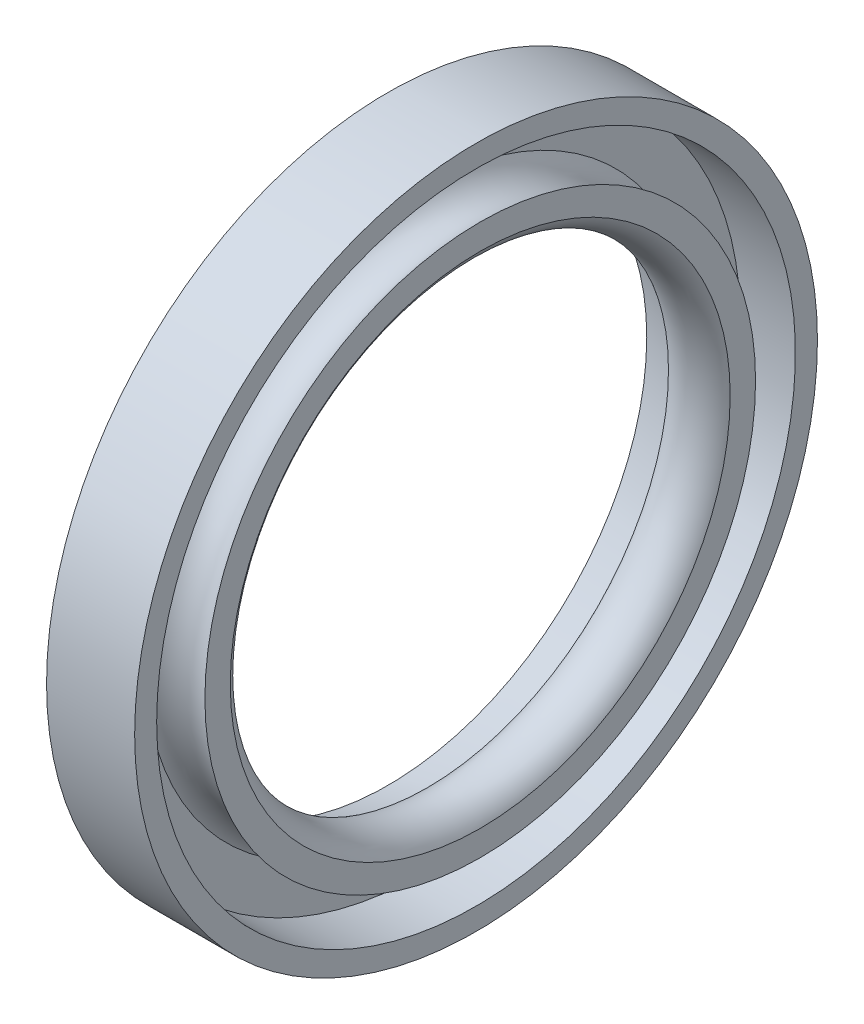
ISO-10303-21;
HEADER;
FILE_DESCRIPTION(('STEP AP214'),'2;1');
FILE_NAME('part.step','',(''),(''),'','','');
FILE_SCHEMA(('AUTOMOTIVE_DESIGN { 1 0 10303 214 1 1 1 1 }'));
ENDSEC;
DATA;
#1=APPLICATION_CONTEXT('core data for automotive mechanical design processes');
#2=APPLICATION_PROTOCOL_DEFINITION('international standard','automotive_design',2000,#1);
#3=PRODUCT_CONTEXT('',#1,'mechanical');
#4=PRODUCT('Part','Part','',(#3));
#5=PRODUCT_RELATED_PRODUCT_CATEGORY('part','',(#4));
#6=PRODUCT_DEFINITION_FORMATION('','',#4);
#7=PRODUCT_DEFINITION_CONTEXT('part definition',#1,'design');
#8=PRODUCT_DEFINITION('design','',#6,#7);
#9=PRODUCT_DEFINITION_SHAPE('','',#8);
#10=(LENGTH_UNIT() NAMED_UNIT(*) SI_UNIT(.MILLI.,.METRE.));
#11=(NAMED_UNIT(*) PLANE_ANGLE_UNIT() SI_UNIT($,.RADIAN.));
#12=(NAMED_UNIT(*) SI_UNIT($,.STERADIAN.) SOLID_ANGLE_UNIT());
#13=UNCERTAINTY_MEASURE_WITH_UNIT(LENGTH_MEASURE(1.E-05),#10,'distance_accuracy_value','');
#14=(GEOMETRIC_REPRESENTATION_CONTEXT(3) GLOBAL_UNCERTAINTY_ASSIGNED_CONTEXT((#13)) GLOBAL_UNIT_ASSIGNED_CONTEXT((#10,
#11,#12)) REPRESENTATION_CONTEXT('',''));
#15=CARTESIAN_POINT('',(0.,0.,0.));
#16=DIRECTION('',(0.,0.,1.));
#17=DIRECTION('',(1.,0.,0.));
#18=AXIS2_PLACEMENT_3D('',#15,#16,#17);
#19=CARTESIAN_POINT('',(-32.,29.,0.));
#20=DIRECTION('',(-1.,0.,0.));
#21=DIRECTION('',(0.,0.,1.));
#22=AXIS2_PLACEMENT_3D('',#19,#20,#21);
#23=PLANE('',#22);
#24=CARTESIAN_POINT('',(-32.,0.,0.));
#25=DIRECTION('',(-1.,0.,0.));
#26=DIRECTION('',(0.,0.,1.));
#27=AXIS2_PLACEMENT_3D('',#24,#25,#26);
#28=CIRCLE('',#27,31.);
#29=CARTESIAN_POINT('',(-32.,0.,31.));
#30=VERTEX_POINT('',#29);
#31=EDGE_CURVE('E45',#30,#30,#28,.T.);
#32=ORIENTED_EDGE('',*,*,#31,.F.);
#33=EDGE_LOOP('',(#32));
#34=FACE_BOUND('',#33,.T.);
#35=CARTESIAN_POINT('',(-32.,0.,0.));
#36=DIRECTION('',(-1.,0.,0.));
#37=DIRECTION('',(0.,0.,1.));
#38=AXIS2_PLACEMENT_3D('',#35,#36,#37);
#39=CIRCLE('',#38,29.);
#40=CARTESIAN_POINT('',(-32.,0.,29.));
#41=VERTEX_POINT('',#40);
#42=EDGE_CURVE('E10',#41,#41,#39,.T.);
#43=ORIENTED_EDGE('',*,*,#42,.T.);
#44=EDGE_LOOP('',(#43));
#45=FACE_BOUND('',#44,.T.);
#46=ADVANCED_FACE('F14',(#34,#45),#23,.F.);
#47=CARTESIAN_POINT('',(-120.,0.,0.));
#48=DIRECTION('',(-1.,0.,0.));
#49=DIRECTION('',(0.,0.,1.));
#50=AXIS2_PLACEMENT_3D('',#47,#48,#49);
#51=CYLINDRICAL_SURFACE('',#50,29.);
#52=ORIENTED_EDGE('',*,*,#42,.F.);
#53=EDGE_LOOP('',(#52));
#54=FACE_BOUND('',#53,.T.);
#55=CARTESIAN_POINT('',(-37.,0.,0.));
#56=DIRECTION('',(-1.,0.,0.));
#57=DIRECTION('',(0.,0.,1.));
#58=AXIS2_PLACEMENT_3D('',#55,#56,#57);
#59=CIRCLE('',#58,29.);
#60=CARTESIAN_POINT('',(-37.,0.,29.));
#61=VERTEX_POINT('',#60);
#62=EDGE_CURVE('E20',#61,#61,#59,.T.);
#63=ORIENTED_EDGE('',*,*,#62,.T.);
#64=EDGE_LOOP('',(#63));
#65=FACE_BOUND('',#64,.T.);
#66=ADVANCED_FACE('F52',(#54,#65),#51,.F.);
#67=CARTESIAN_POINT('',(-37.,25.,0.));
#68=DIRECTION('',(-1.,0.,0.));
#69=DIRECTION('',(0.,0.,1.));
#70=AXIS2_PLACEMENT_3D('',#67,#68,#69);
#71=PLANE('',#70);
#72=ORIENTED_EDGE('',*,*,#62,.F.);
#73=EDGE_LOOP('',(#72));
#74=FACE_BOUND('',#73,.T.);
#75=CARTESIAN_POINT('',(-37.,0.,0.));
#76=DIRECTION('',(-1.,0.,0.));
#77=DIRECTION('',(0.,0.,1.));
#78=AXIS2_PLACEMENT_3D('',#75,#76,#77);
#79=CIRCLE('',#78,25.);
#80=CARTESIAN_POINT('',(-37.,0.,25.));
#81=VERTEX_POINT('',#80);
#82=EDGE_CURVE('E24',#81,#81,#79,.T.);
#83=ORIENTED_EDGE('',*,*,#82,.T.);
#84=EDGE_LOOP('',(#83));
#85=FACE_BOUND('',#84,.T.);
#86=ADVANCED_FACE('F57',(#74,#85),#71,.F.);
#87=CARTESIAN_POINT('',(-34.3105288852963,0.,0.));
#88=DIRECTION('',(-1.,0.,0.));
#89=DIRECTION('',(0.,0.,1.));
#90=AXIS2_PLACEMENT_3D('',#87,#88,#89);
#91=TOROIDAL_SURFACE('',#90,26.3291896490624,3.);
#92=ORIENTED_EDGE('',*,*,#82,.F.);
#93=EDGE_LOOP('',(#92));
#94=FACE_BOUND('',#93,.T.);
#95=CARTESIAN_POINT('',(-31.6210577705927,0.,0.));
#96=DIRECTION('',(-1.,0.,0.));
#97=DIRECTION('',(0.,0.,1.));
#98=AXIS2_PLACEMENT_3D('',#95,#96,#97);
#99=CIRCLE('',#98,25.);
#100=CARTESIAN_POINT('',(-31.6210577705927,0.,25.));
#101=VERTEX_POINT('',#100);
#102=EDGE_CURVE('E28',#101,#101,#99,.T.);
#103=ORIENTED_EDGE('',*,*,#102,.T.);
#104=EDGE_LOOP('',(#103));
#105=FACE_BOUND('',#104,.T.);
#106=ADVANCED_FACE('F62',(#94,#105),#91,.F.);
#107=CARTESIAN_POINT('',(-31.6210577705927,22.6961524227065,0.));
#108=DIRECTION('',(-1.,0.,0.));
#109=DIRECTION('',(0.,0.,1.));
#110=AXIS2_PLACEMENT_3D('',#107,#108,#109);
#111=PLANE('',#110);
#112=ORIENTED_EDGE('',*,*,#102,.F.);
#113=EDGE_LOOP('',(#112));
#114=FACE_BOUND('',#113,.T.);
#115=CARTESIAN_POINT('',(-31.6210577705927,0.,0.));
#116=DIRECTION('',(-1.,0.,0.));
#117=DIRECTION('',(0.,0.,1.));
#118=AXIS2_PLACEMENT_3D('',#115,#116,#117);
#119=CIRCLE('',#118,22.6961524227065);
#120=CARTESIAN_POINT('',(-31.6210577705927,0.,22.6961524227065));
#121=VERTEX_POINT('',#120);
#122=EDGE_CURVE('E33',#121,#121,#119,.T.);
#123=ORIENTED_EDGE('',*,*,#122,.T.);
#124=EDGE_LOOP('',(#123));
#125=FACE_BOUND('',#124,.T.);
#126=ADVANCED_FACE('F68',(#114,#125),#111,.F.);
#127=CARTESIAN_POINT('',(-34.3105288852963,0.,0.));
#128=DIRECTION('',(-1.,0.,0.));
#129=DIRECTION('',(0.,0.,1.));
#130=AXIS2_PLACEMENT_3D('',#127,#128,#129);
#131=TOROIDAL_SURFACE('',#130,24.025342071769,3.);
#132=ORIENTED_EDGE('',*,*,#122,.F.);
#133=EDGE_LOOP('',(#132));
#134=FACE_BOUND('',#133,.T.);
#135=CARTESIAN_POINT('',(-37.,0.,0.));
#136=DIRECTION('',(-1.,0.,0.));
#137=DIRECTION('',(0.,0.,1.));
#138=AXIS2_PLACEMENT_3D('',#135,#136,#137);
#139=CIRCLE('',#138,22.6961524227066);
#140=CARTESIAN_POINT('',(-37.,0.,22.6961524227066));
#141=VERTEX_POINT('',#140);
#142=EDGE_CURVE('E36',#141,#141,#139,.T.);
#143=ORIENTED_EDGE('',*,*,#142,.T.);
#144=EDGE_LOOP('',(#143));
#145=FACE_BOUND('',#144,.T.);
#146=ADVANCED_FACE('F72',(#134,#145),#131,.T.);
#147=CARTESIAN_POINT('',(-40.,0.,0.));
#148=DIRECTION('',(-1.,0.,0.));
#149=DIRECTION('',(0.,0.,1.));
#150=AXIS2_PLACEMENT_3D('',#147,#148,#149);
#151=CONICAL_SURFACE('',#150,23.5,0.261799387799145);
#152=ORIENTED_EDGE('',*,*,#142,.F.);
#153=EDGE_LOOP('',(#152));
#154=FACE_BOUND('',#153,.T.);
#155=CARTESIAN_POINT('',(-40.,0.,0.));
#156=DIRECTION('',(-1.,0.,0.));
#157=DIRECTION('',(0.,0.,1.));
#158=AXIS2_PLACEMENT_3D('',#155,#156,#157);
#159=CIRCLE('',#158,23.5);
#160=CARTESIAN_POINT('',(-40.,0.,23.5));
#161=VERTEX_POINT('',#160);
#162=EDGE_CURVE('E39',#161,#161,#159,.T.);
#163=ORIENTED_EDGE('',*,*,#162,.T.);
#164=EDGE_LOOP('',(#163));
#165=FACE_BOUND('',#164,.T.);
#166=ADVANCED_FACE('F76',(#154,#165),#151,.F.);
#167=CARTESIAN_POINT('',(-40.,31.,0.));
#168=DIRECTION('',(1.,0.,0.));
#169=DIRECTION('',(0.,0.,-1.));
#170=AXIS2_PLACEMENT_3D('',#167,#168,#169);
#171=PLANE('',#170);
#172=ORIENTED_EDGE('',*,*,#162,.F.);
#173=EDGE_LOOP('',(#172));
#174=FACE_BOUND('',#173,.T.);
#175=CARTESIAN_POINT('',(-40.,0.,0.));
#176=DIRECTION('',(-1.,0.,0.));
#177=DIRECTION('',(0.,0.,1.));
#178=AXIS2_PLACEMENT_3D('',#175,#176,#177);
#179=CIRCLE('',#178,31.);
#180=CARTESIAN_POINT('',(-40.,0.,31.));
#181=VERTEX_POINT('',#180);
#182=EDGE_CURVE('E42',#181,#181,#179,.T.);
#183=ORIENTED_EDGE('',*,*,#182,.T.);
#184=EDGE_LOOP('',(#183));
#185=FACE_BOUND('',#184,.T.);
#186=ADVANCED_FACE('F80',(#174,#185),#171,.F.);
#187=CARTESIAN_POINT('',(-120.,0.,0.));
#188=DIRECTION('',(-1.,0.,0.));
#189=DIRECTION('',(0.,0.,1.));
#190=AXIS2_PLACEMENT_3D('',#187,#188,#189);
#191=CYLINDRICAL_SURFACE('',#190,31.);
#192=ORIENTED_EDGE('',*,*,#182,.F.);
#193=EDGE_LOOP('',(#192));
#194=FACE_BOUND('',#193,.T.);
#195=ORIENTED_EDGE('',*,*,#31,.T.);
#196=EDGE_LOOP('',(#195));
#197=FACE_BOUND('',#196,.T.);
#198=ADVANCED_FACE('F49',(#194,#197),#191,.T.);
#199=CLOSED_SHELL('',(#46,#66,#86,#106,#126,#146,#166,#186,#198));
#200=MANIFOLD_SOLID_BREP('B1',#199);
#201=ADVANCED_BREP_SHAPE_REPRESENTATION('',(#18,#200),#14);
#202=SHAPE_DEFINITION_REPRESENTATION(#9,#201);
ENDSEC;
END-ISO-10303-21;
